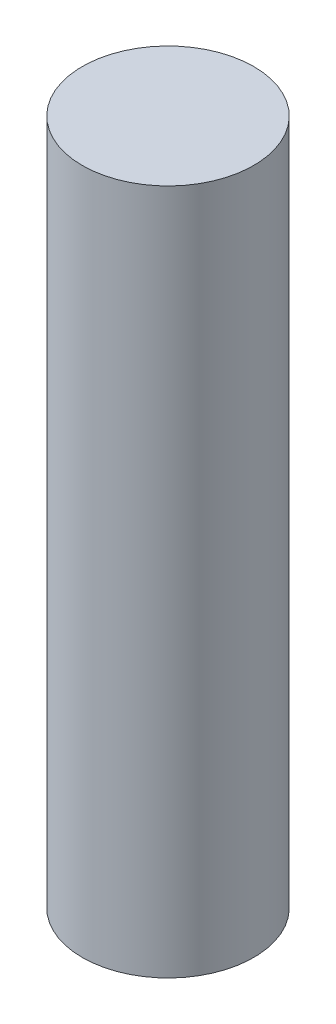
ISO-10303-21;
HEADER;
FILE_DESCRIPTION(('STEP AP214'),'2;1');
FILE_NAME('part.step','',(''),(''),'','','');
FILE_SCHEMA(('AUTOMOTIVE_DESIGN { 1 0 10303 214 1 1 1 1 }'));
ENDSEC;
DATA;
#1=APPLICATION_CONTEXT('core data for automotive mechanical design processes');
#2=APPLICATION_PROTOCOL_DEFINITION('international standard','automotive_design',2000,#1);
#3=PRODUCT_CONTEXT('',#1,'mechanical');
#4=PRODUCT('Part','Part','',(#3));
#5=PRODUCT_RELATED_PRODUCT_CATEGORY('part','',(#4));
#6=PRODUCT_DEFINITION_FORMATION('','',#4);
#7=PRODUCT_DEFINITION_CONTEXT('part definition',#1,'design');
#8=PRODUCT_DEFINITION('design','',#6,#7);
#9=PRODUCT_DEFINITION_SHAPE('','',#8);
#10=(LENGTH_UNIT() NAMED_UNIT(*) SI_UNIT(.MILLI.,.METRE.));
#11=(NAMED_UNIT(*) PLANE_ANGLE_UNIT() SI_UNIT($,.RADIAN.));
#12=(NAMED_UNIT(*) SI_UNIT($,.STERADIAN.) SOLID_ANGLE_UNIT());
#13=UNCERTAINTY_MEASURE_WITH_UNIT(LENGTH_MEASURE(1.E-05),#10,'distance_accuracy_value','');
#14=(GEOMETRIC_REPRESENTATION_CONTEXT(3) GLOBAL_UNCERTAINTY_ASSIGNED_CONTEXT((#13)) GLOBAL_UNIT_ASSIGNED_CONTEXT((#10,
#11,#12)) REPRESENTATION_CONTEXT('',''));
#15=CARTESIAN_POINT('',(0.,0.,0.));
#16=DIRECTION('',(0.,0.,1.));
#17=DIRECTION('',(1.,0.,0.));
#18=AXIS2_PLACEMENT_3D('',#15,#16,#17);
#19=CARTESIAN_POINT('',(0.,50.,0.));
#20=DIRECTION('',(0.,-1.,0.));
#21=DIRECTION('',(0.,0.,-1.));
#22=AXIS2_PLACEMENT_3D('',#19,#20,#21);
#23=CYLINDRICAL_SURFACE('',#22,6.25);
#24=CARTESIAN_POINT('',(0.,50.,0.));
#25=DIRECTION('',(0.,1.,0.));
#26=DIRECTION('',(0.,0.,1.));
#27=AXIS2_PLACEMENT_3D('',#24,#25,#26);
#28=CIRCLE('',#27,6.25);
#29=CARTESIAN_POINT('',(0.,50.,6.25));
#30=VERTEX_POINT('',#29);
#31=EDGE_CURVE('E10',#30,#30,#28,.T.);
#32=ORIENTED_EDGE('',*,*,#31,.F.);
#33=EDGE_LOOP('',(#32));
#34=FACE_BOUND('',#33,.T.);
#35=CARTESIAN_POINT('',(0.,0.,0.));
#36=DIRECTION('',(0.,1.,0.));
#37=DIRECTION('',(0.,0.,1.));
#38=AXIS2_PLACEMENT_3D('',#35,#36,#37);
#39=CIRCLE('',#38,6.25);
#40=CARTESIAN_POINT('',(0.,0.,6.25));
#41=VERTEX_POINT('',#40);
#42=EDGE_CURVE('E36',#41,#41,#39,.T.);
#43=ORIENTED_EDGE('',*,*,#42,.T.);
#44=EDGE_LOOP('',(#43));
#45=FACE_BOUND('',#44,.T.);
#46=ADVANCED_FACE('F33',(#34,#45),#23,.T.);
#47=CARTESIAN_POINT('',(0.,50.,0.));
#48=DIRECTION('',(0.,1.,0.));
#49=DIRECTION('',(0.,0.,1.));
#50=AXIS2_PLACEMENT_3D('',#47,#48,#49);
#51=PLANE('',#50);
#52=ORIENTED_EDGE('',*,*,#31,.T.);
#53=EDGE_LOOP('',(#52));
#54=FACE_BOUND('',#53,.T.);
#55=ADVANCED_FACE('F48',(#54),#51,.T.);
#56=CARTESIAN_POINT('',(0.,0.,0.));
#57=DIRECTION('',(0.,1.,0.));
#58=DIRECTION('',(0.,0.,1.));
#59=AXIS2_PLACEMENT_3D('',#56,#57,#58);
#60=PLANE('',#59);
#61=ORIENTED_EDGE('',*,*,#42,.F.);
#62=EDGE_LOOP('',(#61));
#63=FACE_BOUND('',#62,.T.);
#64=ADVANCED_FACE('F46',(#63),#60,.F.);
#65=CLOSED_SHELL('',(#46,#55,#64));
#66=MANIFOLD_SOLID_BREP('B2',#65);
#67=ADVANCED_BREP_SHAPE_REPRESENTATION('',(#18,#66),#14);
#68=SHAPE_DEFINITION_REPRESENTATION(#9,#67);
ENDSEC;
END-ISO-10303-21;
